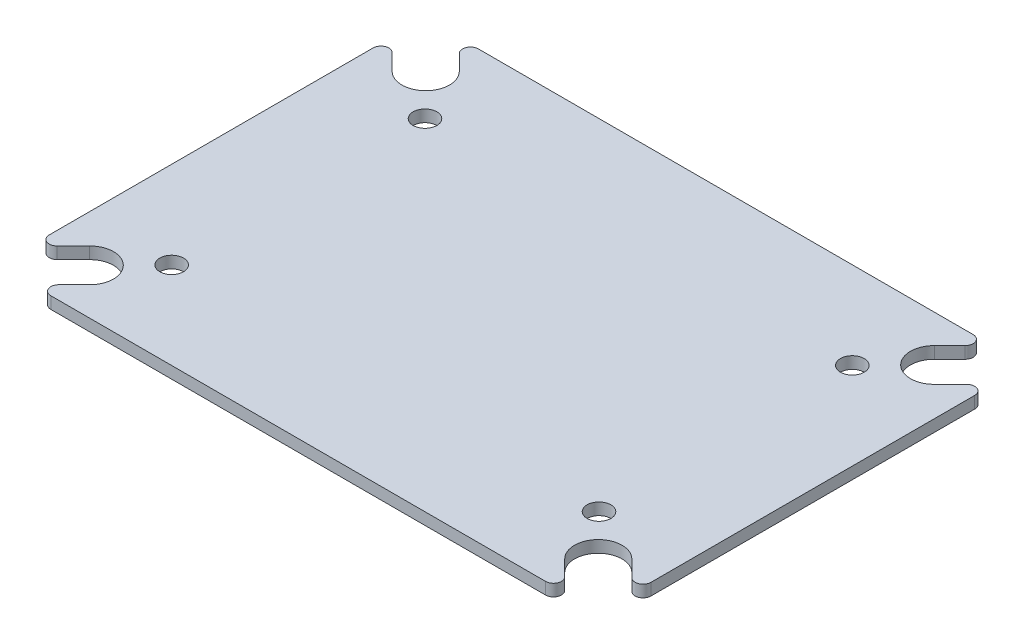
ISO-10303-21;
HEADER;
FILE_DESCRIPTION(('STEP AP214'),'2;1');
FILE_NAME('part.step','',(''),(''),'','','');
FILE_SCHEMA(('AUTOMOTIVE_DESIGN { 1 0 10303 214 1 1 1 1 }'));
ENDSEC;
DATA;
#1=APPLICATION_CONTEXT('core data for automotive mechanical design processes');
#2=APPLICATION_PROTOCOL_DEFINITION('international standard','automotive_design',2000,#1);
#3=PRODUCT_CONTEXT('',#1,'mechanical');
#4=PRODUCT('Part','Part','',(#3));
#5=PRODUCT_RELATED_PRODUCT_CATEGORY('part','',(#4));
#6=PRODUCT_DEFINITION_FORMATION('','',#4);
#7=PRODUCT_DEFINITION_CONTEXT('part definition',#1,'design');
#8=PRODUCT_DEFINITION('design','',#6,#7);
#9=PRODUCT_DEFINITION_SHAPE('','',#8);
#10=(LENGTH_UNIT() NAMED_UNIT(*) SI_UNIT(.MILLI.,.METRE.));
#11=(NAMED_UNIT(*) PLANE_ANGLE_UNIT() SI_UNIT($,.RADIAN.));
#12=(NAMED_UNIT(*) SI_UNIT($,.STERADIAN.) SOLID_ANGLE_UNIT());
#13=UNCERTAINTY_MEASURE_WITH_UNIT(LENGTH_MEASURE(1.E-05),#10,'distance_accuracy_value','');
#14=(GEOMETRIC_REPRESENTATION_CONTEXT(3) GLOBAL_UNCERTAINTY_ASSIGNED_CONTEXT((#13)) GLOBAL_UNIT_ASSIGNED_CONTEXT((#10,
#11,#12)) REPRESENTATION_CONTEXT('',''));
#15=CARTESIAN_POINT('',(0.,0.,0.));
#16=DIRECTION('',(0.,0.,1.));
#17=DIRECTION('',(1.,0.,0.));
#18=AXIS2_PLACEMENT_3D('',#15,#16,#17);
#19=CARTESIAN_POINT('',(69.2449575216843,1.5,3.));
#20=DIRECTION('',(0.,1.,0.));
#21=DIRECTION('',(0.,0.,1.));
#22=AXIS2_PLACEMENT_3D('',#19,#20,#21);
#23=PLANE('',#22);
#24=CARTESIAN_POINT('',(64.9875,1.5,44.998836792118));
#25=DIRECTION('',(0.,1.,0.));
#26=DIRECTION('',(0.,0.,1.));
#27=AXIS2_PLACEMENT_3D('',#24,#25,#26);
#28=CIRCLE('',#27,1.49999999999998);
#29=CARTESIAN_POINT('',(64.9875,1.5,46.498836792118));
#30=VERTEX_POINT('',#29);
#31=EDGE_CURVE('E446',#30,#30,#28,.T.);
#32=ORIENTED_EDGE('',*,*,#31,.F.);
#33=EDGE_LOOP('',(#32));
#34=FACE_BOUND('',#33,.T.);
#35=CARTESIAN_POINT('',(11.0125,1.5,13.001163207882));
#36=DIRECTION('',(0.,1.,0.));
#37=DIRECTION('',(0.,0.,1.));
#38=AXIS2_PLACEMENT_3D('',#35,#36,#37);
#39=CIRCLE('',#38,1.5);
#40=CARTESIAN_POINT('',(11.0125,1.5,14.501163207882));
#41=VERTEX_POINT('',#40);
#42=EDGE_CURVE('E228',#41,#41,#39,.T.);
#43=ORIENTED_EDGE('',*,*,#42,.F.);
#44=EDGE_LOOP('',(#43));
#45=FACE_BOUND('',#44,.T.);
#46=CARTESIAN_POINT('',(69.2449575216843,1.5,3.));
#47=DIRECTION('',(0.,1.,0.));
#48=DIRECTION('',(0.,0.,1.));
#49=AXIS2_PLACEMENT_3D('',#46,#47,#48);
#50=CIRCLE('',#49,1.);
#51=CARTESIAN_POINT('',(69.9513797645574,1.5,3.70779065745049));
#52=VERTEX_POINT('',#51);
#53=CARTESIAN_POINT('',(69.2449575216843,1.5,2.));
#54=VERTEX_POINT('',#53);
#55=EDGE_CURVE('E271',#52,#54,#50,.T.);
#56=ORIENTED_EDGE('',*,*,#55,.T.);
#57=DIRECTION('',(-1.,0.,0.));
#58=VECTOR('',#57,1.);
#59=CARTESIAN_POINT('',(6.75504247831573,1.5,2.00000000000001));
#60=LINE('',#59,#58);
#61=CARTESIAN_POINT('',(6.75504247831573,1.5,2.00000000000001));
#62=VERTEX_POINT('',#61);
#63=EDGE_CURVE('E139',#54,#62,#60,.T.);
#64=ORIENTED_EDGE('',*,*,#63,.T.);
#65=CARTESIAN_POINT('',(6.75504247831571,1.5,3.00000000000001));
#66=DIRECTION('',(0.,1.,0.));
#67=DIRECTION('',(0.,0.,1.));
#68=AXIS2_PLACEMENT_3D('',#65,#66,#67);
#69=CIRCLE('',#68,1.);
#70=CARTESIAN_POINT('',(6.04862023544265,1.5,3.7077906574505));
#71=VERTEX_POINT('',#70);
#72=EDGE_CURVE('E334',#62,#71,#69,.T.);
#73=ORIENTED_EDGE('',*,*,#72,.T.);
#74=DIRECTION('',(0.707790657450473,0.,0.706422242873076));
#75=VECTOR('',#74,1.);
#76=CARTESIAN_POINT('',(8.00366605642963,1.5,5.659056669856));
#77=LINE('',#76,#75);
#78=CARTESIAN_POINT('',(8.00366605642963,1.5,5.659056669856));
#79=VERTEX_POINT('',#78);
#80=EDGE_CURVE('E353',#71,#79,#77,.T.);
#81=ORIENTED_EDGE('',*,*,#80,.T.);
#82=CARTESIAN_POINT('',(5.8843993278104,1.5,7.78242864220743));
#83=DIRECTION('',(0.,-1.,0.));
#84=DIRECTION('',(0.,0.,1.));
#85=AXIS2_PLACEMENT_3D('',#82,#83,#84);
#86=CIRCLE('',#85,3.);
#87=CARTESIAN_POINT('',(3.76307898425076,1.5,9.90374898576707));
#88=VERTEX_POINT('',#87);
#89=EDGE_CURVE('E350',#79,#88,#86,.T.);
#90=ORIENTED_EDGE('',*,*,#89,.T.);
#91=DIRECTION('',(-0.707106781186546,0.,-0.707106781186549));
#92=VECTOR('',#91,1.);
#93=CARTESIAN_POINT('',(3.76307898425076,1.5,9.90374898576707));
#94=LINE('',#93,#92);
#95=CARTESIAN_POINT('',(1.70710678118657,1.5,7.84777678270287));
#96=VERTEX_POINT('',#95);
#97=EDGE_CURVE('E352',#88,#96,#94,.T.);
#98=ORIENTED_EDGE('',*,*,#97,.T.);
#99=CARTESIAN_POINT('',(1.,1.5,8.5548835638894));
#100=DIRECTION('',(0.,1.,0.));
#101=DIRECTION('',(0.,0.,-1.));
#102=AXIS2_PLACEMENT_3D('',#99,#100,#101);
#103=CIRCLE('',#102,1.);
#104=CARTESIAN_POINT('',(0.,1.5,8.55488356388942));
#105=VERTEX_POINT('',#104);
#106=EDGE_CURVE('E355',#96,#105,#103,.T.);
#107=ORIENTED_EDGE('',*,*,#106,.T.);
#108=DIRECTION('',(0.,0.,1.));
#109=VECTOR('',#108,1.);
#110=CARTESIAN_POINT('',(0.,1.5,8.55488356388942));
#111=LINE('',#110,#109);
#112=CARTESIAN_POINT('',(0.,1.5,49.4451164361106));
#113=VERTEX_POINT('',#112);
#114=EDGE_CURVE('E361',#105,#113,#111,.T.);
#115=ORIENTED_EDGE('',*,*,#114,.T.);
#116=CARTESIAN_POINT('',(1.,1.5,49.4451164361106));
#117=DIRECTION('',(0.,1.,0.));
#118=DIRECTION('',(0.,0.,-1.));
#119=AXIS2_PLACEMENT_3D('',#116,#117,#118);
#120=CIRCLE('',#119,1.);
#121=CARTESIAN_POINT('',(1.70710678118656,1.5,50.1522232172971));
#122=VERTEX_POINT('',#121);
#123=EDGE_CURVE('E363',#113,#122,#120,.T.);
#124=ORIENTED_EDGE('',*,*,#123,.T.);
#125=DIRECTION('',(0.707106781186546,0.,-0.707106781186549));
#126=VECTOR('',#125,1.);
#127=CARTESIAN_POINT('',(3.76307898425076,1.5,48.0962510142329));
#128=LINE('',#127,#126);
#129=CARTESIAN_POINT('',(3.76307898425075,1.5,48.0962510142329));
#130=VERTEX_POINT('',#129);
#131=EDGE_CURVE('E365',#122,#130,#128,.T.);
#132=ORIENTED_EDGE('',*,*,#131,.T.);
#133=CARTESIAN_POINT('',(5.8843993278104,1.5,50.2175713577926));
#134=DIRECTION('',(0.,-1.,0.));
#135=DIRECTION('',(0.,0.,-1.));
#136=AXIS2_PLACEMENT_3D('',#133,#134,#135);
#137=CIRCLE('',#136,3.);
#138=CARTESIAN_POINT('',(8.00366605642963,1.5,52.340943330144));
#139=VERTEX_POINT('',#138);
#140=EDGE_CURVE('E367',#130,#139,#137,.T.);
#141=ORIENTED_EDGE('',*,*,#140,.T.);
#142=DIRECTION('',(-0.707790657450474,0.,0.706422242873075));
#143=VECTOR('',#142,1.);
#144=CARTESIAN_POINT('',(8.00366605642963,1.5,52.340943330144));
#145=LINE('',#144,#143);
#146=CARTESIAN_POINT('',(6.04862023544265,1.5,54.2922093425495));
#147=VERTEX_POINT('',#146);
#148=EDGE_CURVE('E369',#139,#147,#145,.T.);
#149=ORIENTED_EDGE('',*,*,#148,.T.);
#150=CARTESIAN_POINT('',(6.75504247831571,1.5,55.));
#151=DIRECTION('',(0.,1.,0.));
#152=DIRECTION('',(0.,0.,1.));
#153=AXIS2_PLACEMENT_3D('',#150,#151,#152);
#154=CIRCLE('',#153,1.);
#155=CARTESIAN_POINT('',(6.75504247831573,1.5,56.));
#156=VERTEX_POINT('',#155);
#157=EDGE_CURVE('E371',#147,#156,#154,.T.);
#158=ORIENTED_EDGE('',*,*,#157,.T.);
#159=DIRECTION('',(1.,0.,0.));
#160=VECTOR('',#159,1.);
#161=CARTESIAN_POINT('',(6.75504247831573,1.5,56.));
#162=LINE('',#161,#160);
#163=CARTESIAN_POINT('',(69.2449575216843,1.5,56.));
#164=VERTEX_POINT('',#163);
#165=EDGE_CURVE('E373',#156,#164,#162,.T.);
#166=ORIENTED_EDGE('',*,*,#165,.T.);
#167=CARTESIAN_POINT('',(69.2449575216843,1.5,55.));
#168=DIRECTION('',(0.,1.,0.));
#169=DIRECTION('',(0.,0.,-1.));
#170=AXIS2_PLACEMENT_3D('',#167,#168,#169);
#171=CIRCLE('',#170,0.999999999999998);
#172=CARTESIAN_POINT('',(69.9513797645573,1.5,54.2922093425495));
#173=VERTEX_POINT('',#172);
#174=EDGE_CURVE('E375',#164,#173,#171,.T.);
#175=ORIENTED_EDGE('',*,*,#174,.T.);
#176=DIRECTION('',(-0.707790657450472,0.,-0.706422242873077));
#177=VECTOR('',#176,1.);
#178=CARTESIAN_POINT('',(67.9963339435704,1.5,52.340943330144));
#179=LINE('',#178,#177);
#180=CARTESIAN_POINT('',(67.9963339435704,1.5,52.340943330144));
#181=VERTEX_POINT('',#180);
#182=EDGE_CURVE('E377',#173,#181,#179,.T.);
#183=ORIENTED_EDGE('',*,*,#182,.T.);
#184=CARTESIAN_POINT('',(70.1156006721896,1.5,50.2175713577926));
#185=DIRECTION('',(0.,-1.,0.));
#186=DIRECTION('',(0.,0.,1.));
#187=AXIS2_PLACEMENT_3D('',#184,#185,#186);
#188=CIRCLE('',#187,3.);
#189=CARTESIAN_POINT('',(72.2369210157492,1.5,48.0962510142329));
#190=VERTEX_POINT('',#189);
#191=EDGE_CURVE('E379',#181,#190,#188,.T.);
#192=ORIENTED_EDGE('',*,*,#191,.T.);
#193=DIRECTION('',(0.707106781186547,0.,0.707106781186547));
#194=VECTOR('',#193,1.);
#195=CARTESIAN_POINT('',(72.2369210157492,1.5,48.0962510142329));
#196=LINE('',#195,#194);
#197=CARTESIAN_POINT('',(74.2928932188134,1.5,50.1522232172972));
#198=VERTEX_POINT('',#197);
#199=EDGE_CURVE('E381',#190,#198,#196,.T.);
#200=ORIENTED_EDGE('',*,*,#199,.T.);
#201=CARTESIAN_POINT('',(75.,1.5,49.4451164361106));
#202=DIRECTION('',(0.,1.,0.));
#203=DIRECTION('',(0.,0.,1.));
#204=AXIS2_PLACEMENT_3D('',#201,#202,#203);
#205=CIRCLE('',#204,0.999999999999999);
#206=CARTESIAN_POINT('',(76.,1.5,49.4451164361106));
#207=VERTEX_POINT('',#206);
#208=EDGE_CURVE('E383',#198,#207,#205,.T.);
#209=ORIENTED_EDGE('',*,*,#208,.T.);
#210=DIRECTION('',(0.,0.,-1.));
#211=VECTOR('',#210,1.);
#212=CARTESIAN_POINT('',(76.,1.5,8.55488356388941));
#213=LINE('',#212,#211);
#214=CARTESIAN_POINT('',(76.,1.5,8.55488356388941));
#215=VERTEX_POINT('',#214);
#216=EDGE_CURVE('E385',#207,#215,#213,.T.);
#217=ORIENTED_EDGE('',*,*,#216,.T.);
#218=CARTESIAN_POINT('',(75.,1.5,8.55488356388938));
#219=DIRECTION('',(0.,1.,0.));
#220=DIRECTION('',(0.,0.,-1.));
#221=AXIS2_PLACEMENT_3D('',#218,#219,#220);
#222=CIRCLE('',#221,0.999999999999998);
#223=CARTESIAN_POINT('',(74.2928932188134,1.5,7.84777678270286));
#224=VERTEX_POINT('',#223);
#225=EDGE_CURVE('E206',#215,#224,#222,.T.);
#226=ORIENTED_EDGE('',*,*,#225,.T.);
#227=DIRECTION('',(-0.707106781186548,0.,0.707106781186547));
#228=VECTOR('',#227,1.);
#229=CARTESIAN_POINT('',(72.2369210157492,1.5,9.90374898576706));
#230=LINE('',#229,#228);
#231=CARTESIAN_POINT('',(72.2369210157492,1.5,9.90374898576707));
#232=VERTEX_POINT('',#231);
#233=EDGE_CURVE('E200',#224,#232,#230,.T.);
#234=ORIENTED_EDGE('',*,*,#233,.T.);
#235=CARTESIAN_POINT('',(70.1156006721896,1.5,7.78242864220742));
#236=DIRECTION('',(0.,-1.,0.));
#237=DIRECTION('',(0.,0.,-1.));
#238=AXIS2_PLACEMENT_3D('',#235,#236,#237);
#239=CIRCLE('',#238,3.00000000000001);
#240=CARTESIAN_POINT('',(67.9963339435703,1.5,5.65905666985599));
#241=VERTEX_POINT('',#240);
#242=EDGE_CURVE('E204',#232,#241,#239,.T.);
#243=ORIENTED_EDGE('',*,*,#242,.T.);
#244=DIRECTION('',(0.707790657450478,0.,-0.706422242873071));
#245=VECTOR('',#244,1.);
#246=CARTESIAN_POINT('',(67.9963339435703,1.5,5.65905666985599));
#247=LINE('',#246,#245);
#248=EDGE_CURVE('E48',#241,#52,#247,.T.);
#249=ORIENTED_EDGE('',*,*,#248,.T.);
#250=EDGE_LOOP('',(#56,#64,#73,#81,#90,#98,#107,#115,#124,#132,#141,#149,#158,#166,#175,#183,
#192,#200,#209,#217,#226,#234,#243,#249));
#251=FACE_BOUND('',#250,.T.);
#252=CARTESIAN_POINT('',(64.9875,1.5,13.001163207882));
#253=DIRECTION('',(0.,1.,0.));
#254=DIRECTION('',(0.,0.,-1.));
#255=AXIS2_PLACEMENT_3D('',#252,#253,#254);
#256=CIRCLE('',#255,1.49999999999998);
#257=CARTESIAN_POINT('',(64.9875,1.5,11.501163207882));
#258=VERTEX_POINT('',#257);
#259=EDGE_CURVE('E452',#258,#258,#256,.T.);
#260=ORIENTED_EDGE('',*,*,#259,.F.);
#261=EDGE_LOOP('',(#260));
#262=FACE_BOUND('',#261,.T.);
#263=CARTESIAN_POINT('',(11.0125,1.5,44.998836792118));
#264=DIRECTION('',(0.,1.,0.));
#265=DIRECTION('',(0.,0.,-1.));
#266=AXIS2_PLACEMENT_3D('',#263,#264,#265);
#267=CIRCLE('',#266,1.5);
#268=CARTESIAN_POINT('',(11.0125,1.5,43.498836792118));
#269=VERTEX_POINT('',#268);
#270=EDGE_CURVE('E437',#269,#269,#267,.T.);
#271=ORIENTED_EDGE('',*,*,#270,.F.);
#272=EDGE_LOOP('',(#271));
#273=FACE_BOUND('',#272,.T.);
#274=ADVANCED_FACE('F31',(#34,#45,#251,#262,#273),#23,.T.);
#275=CARTESIAN_POINT('',(69.2449575216843,0.,3.));
#276=DIRECTION('',(0.,1.,0.));
#277=DIRECTION('',(0.,0.,1.));
#278=AXIS2_PLACEMENT_3D('',#275,#276,#277);
#279=PLANE('',#278);
#280=CARTESIAN_POINT('',(64.9875,0.,44.998836792118));
#281=DIRECTION('',(0.,1.,0.));
#282=DIRECTION('',(0.,0.,1.));
#283=AXIS2_PLACEMENT_3D('',#280,#281,#282);
#284=CIRCLE('',#283,1.49999999999998);
#285=CARTESIAN_POINT('',(64.9875,0.,46.498836792118));
#286=VERTEX_POINT('',#285);
#287=EDGE_CURVE('E443',#286,#286,#284,.T.);
#288=ORIENTED_EDGE('',*,*,#287,.T.);
#289=EDGE_LOOP('',(#288));
#290=FACE_BOUND('',#289,.T.);
#291=CARTESIAN_POINT('',(11.0125,0.,13.001163207882));
#292=DIRECTION('',(0.,1.,0.));
#293=DIRECTION('',(0.,0.,1.));
#294=AXIS2_PLACEMENT_3D('',#291,#292,#293);
#295=CIRCLE('',#294,1.5);
#296=CARTESIAN_POINT('',(11.0125,0.,14.501163207882));
#297=VERTEX_POINT('',#296);
#298=EDGE_CURVE('E455',#297,#297,#295,.T.);
#299=ORIENTED_EDGE('',*,*,#298,.T.);
#300=EDGE_LOOP('',(#299));
#301=FACE_BOUND('',#300,.T.);
#302=CARTESIAN_POINT('',(69.2449575216843,0.,3.));
#303=DIRECTION('',(0.,1.,0.));
#304=DIRECTION('',(0.,0.,1.));
#305=AXIS2_PLACEMENT_3D('',#302,#303,#304);
#306=CIRCLE('',#305,1.);
#307=CARTESIAN_POINT('',(69.9513797645574,0.,3.70779065745049));
#308=VERTEX_POINT('',#307);
#309=CARTESIAN_POINT('',(69.2449575216843,0.,2.));
#310=VERTEX_POINT('',#309);
#311=EDGE_CURVE('E224',#308,#310,#306,.T.);
#312=ORIENTED_EDGE('',*,*,#311,.F.);
#313=DIRECTION('',(0.707790657450478,0.,-0.706422242873071));
#314=VECTOR('',#313,1.);
#315=CARTESIAN_POINT('',(67.9963339435703,0.,5.65905666985599));
#316=LINE('',#315,#314);
#317=CARTESIAN_POINT('',(67.9963339435703,0.,5.65905666985599));
#318=VERTEX_POINT('',#317);
#319=EDGE_CURVE('E131',#318,#308,#316,.T.);
#320=ORIENTED_EDGE('',*,*,#319,.F.);
#321=CARTESIAN_POINT('',(70.1156006721896,0.,7.78242864220742));
#322=DIRECTION('',(0.,-1.,0.));
#323=DIRECTION('',(0.,0.,-1.));
#324=AXIS2_PLACEMENT_3D('',#321,#322,#323);
#325=CIRCLE('',#324,3.00000000000001);
#326=CARTESIAN_POINT('',(72.2369210157492,0.,9.90374898576707));
#327=VERTEX_POINT('',#326);
#328=EDGE_CURVE('E125',#327,#318,#325,.T.);
#329=ORIENTED_EDGE('',*,*,#328,.F.);
#330=DIRECTION('',(-0.707106781186548,0.,0.707106781186547));
#331=VECTOR('',#330,1.);
#332=CARTESIAN_POINT('',(72.2369210157492,0.,9.90374898576706));
#333=LINE('',#332,#331);
#334=CARTESIAN_POINT('',(74.2928932188134,0.,7.84777678270286));
#335=VERTEX_POINT('',#334);
#336=EDGE_CURVE('E214',#335,#327,#333,.T.);
#337=ORIENTED_EDGE('',*,*,#336,.F.);
#338=CARTESIAN_POINT('',(75.,0.,8.55488356388938));
#339=DIRECTION('',(0.,1.,0.));
#340=DIRECTION('',(0.,0.,-1.));
#341=AXIS2_PLACEMENT_3D('',#338,#339,#340);
#342=CIRCLE('',#341,0.999999999999998);
#343=CARTESIAN_POINT('',(76.,0.,8.55488356388941));
#344=VERTEX_POINT('',#343);
#345=EDGE_CURVE('E266',#344,#335,#342,.T.);
#346=ORIENTED_EDGE('',*,*,#345,.F.);
#347=DIRECTION('',(0.,0.,-1.));
#348=VECTOR('',#347,1.);
#349=CARTESIAN_POINT('',(76.,0.,8.55488356388941));
#350=LINE('',#349,#348);
#351=CARTESIAN_POINT('',(76.,0.,49.4451164361106));
#352=VERTEX_POINT('',#351);
#353=EDGE_CURVE('E264',#352,#344,#350,.T.);
#354=ORIENTED_EDGE('',*,*,#353,.F.);
#355=CARTESIAN_POINT('',(75.,0.,49.4451164361106));
#356=DIRECTION('',(0.,1.,0.));
#357=DIRECTION('',(0.,0.,1.));
#358=AXIS2_PLACEMENT_3D('',#355,#356,#357);
#359=CIRCLE('',#358,0.999999999999999);
#360=CARTESIAN_POINT('',(74.2928932188134,0.,50.1522232172972));
#361=VERTEX_POINT('',#360);
#362=EDGE_CURVE('E262',#361,#352,#359,.T.);
#363=ORIENTED_EDGE('',*,*,#362,.F.);
#364=DIRECTION('',(0.707106781186547,0.,0.707106781186547));
#365=VECTOR('',#364,1.);
#366=CARTESIAN_POINT('',(72.2369210157492,0.,48.0962510142329));
#367=LINE('',#366,#365);
#368=CARTESIAN_POINT('',(72.2369210157492,0.,48.0962510142329));
#369=VERTEX_POINT('',#368);
#370=EDGE_CURVE('E260',#369,#361,#367,.T.);
#371=ORIENTED_EDGE('',*,*,#370,.F.);
#372=CARTESIAN_POINT('',(70.1156006721896,0.,50.2175713577926));
#373=DIRECTION('',(0.,-1.,0.));
#374=DIRECTION('',(0.,0.,1.));
#375=AXIS2_PLACEMENT_3D('',#372,#373,#374);
#376=CIRCLE('',#375,3.);
#377=CARTESIAN_POINT('',(67.9963339435704,0.,52.340943330144));
#378=VERTEX_POINT('',#377);
#379=EDGE_CURVE('E258',#378,#369,#376,.T.);
#380=ORIENTED_EDGE('',*,*,#379,.F.);
#381=DIRECTION('',(-0.707790657450472,0.,-0.706422242873077));
#382=VECTOR('',#381,1.);
#383=CARTESIAN_POINT('',(67.9963339435704,0.,52.340943330144));
#384=LINE('',#383,#382);
#385=CARTESIAN_POINT('',(69.9513797645573,0.,54.2922093425495));
#386=VERTEX_POINT('',#385);
#387=EDGE_CURVE('E256',#386,#378,#384,.T.);
#388=ORIENTED_EDGE('',*,*,#387,.F.);
#389=CARTESIAN_POINT('',(69.2449575216843,0.,55.));
#390=DIRECTION('',(0.,1.,0.));
#391=DIRECTION('',(0.,0.,-1.));
#392=AXIS2_PLACEMENT_3D('',#389,#390,#391);
#393=CIRCLE('',#392,0.999999999999998);
#394=CARTESIAN_POINT('',(69.2449575216843,0.,56.));
#395=VERTEX_POINT('',#394);
#396=EDGE_CURVE('E254',#395,#386,#393,.T.);
#397=ORIENTED_EDGE('',*,*,#396,.F.);
#398=DIRECTION('',(1.,0.,0.));
#399=VECTOR('',#398,1.);
#400=CARTESIAN_POINT('',(6.75504247831573,0.,56.));
#401=LINE('',#400,#399);
#402=CARTESIAN_POINT('',(6.75504247831573,0.,56.));
#403=VERTEX_POINT('',#402);
#404=EDGE_CURVE('E252',#403,#395,#401,.T.);
#405=ORIENTED_EDGE('',*,*,#404,.F.);
#406=CARTESIAN_POINT('',(6.75504247831571,0.,55.));
#407=DIRECTION('',(0.,1.,0.));
#408=DIRECTION('',(0.,0.,1.));
#409=AXIS2_PLACEMENT_3D('',#406,#407,#408);
#410=CIRCLE('',#409,1.);
#411=CARTESIAN_POINT('',(6.04862023544265,0.,54.2922093425495));
#412=VERTEX_POINT('',#411);
#413=EDGE_CURVE('E250',#412,#403,#410,.T.);
#414=ORIENTED_EDGE('',*,*,#413,.F.);
#415=DIRECTION('',(-0.707790657450474,0.,0.706422242873075));
#416=VECTOR('',#415,1.);
#417=CARTESIAN_POINT('',(8.00366605642963,0.,52.340943330144));
#418=LINE('',#417,#416);
#419=CARTESIAN_POINT('',(8.00366605642963,0.,52.340943330144));
#420=VERTEX_POINT('',#419);
#421=EDGE_CURVE('E248',#420,#412,#418,.T.);
#422=ORIENTED_EDGE('',*,*,#421,.F.);
#423=CARTESIAN_POINT('',(5.8843993278104,0.,50.2175713577926));
#424=DIRECTION('',(0.,-1.,0.));
#425=DIRECTION('',(0.,0.,-1.));
#426=AXIS2_PLACEMENT_3D('',#423,#424,#425);
#427=CIRCLE('',#426,3.);
#428=CARTESIAN_POINT('',(3.76307898425075,0.,48.0962510142329));
#429=VERTEX_POINT('',#428);
#430=EDGE_CURVE('E246',#429,#420,#427,.T.);
#431=ORIENTED_EDGE('',*,*,#430,.F.);
#432=DIRECTION('',(0.707106781186546,0.,-0.707106781186549));
#433=VECTOR('',#432,1.);
#434=CARTESIAN_POINT('',(3.76307898425076,0.,48.0962510142329));
#435=LINE('',#434,#433);
#436=CARTESIAN_POINT('',(1.70710678118656,0.,50.1522232172971));
#437=VERTEX_POINT('',#436);
#438=EDGE_CURVE('E244',#437,#429,#435,.T.);
#439=ORIENTED_EDGE('',*,*,#438,.F.);
#440=CARTESIAN_POINT('',(1.,0.,49.4451164361106));
#441=DIRECTION('',(0.,1.,0.));
#442=DIRECTION('',(0.,0.,-1.));
#443=AXIS2_PLACEMENT_3D('',#440,#441,#442);
#444=CIRCLE('',#443,1.);
#445=CARTESIAN_POINT('',(0.,0.,49.4451164361106));
#446=VERTEX_POINT('',#445);
#447=EDGE_CURVE('E242',#446,#437,#444,.T.);
#448=ORIENTED_EDGE('',*,*,#447,.F.);
#449=DIRECTION('',(0.,0.,1.));
#450=VECTOR('',#449,1.);
#451=CARTESIAN_POINT('',(0.,0.,8.55488356388942));
#452=LINE('',#451,#450);
#453=CARTESIAN_POINT('',(0.,0.,8.55488356388942));
#454=VERTEX_POINT('',#453);
#455=EDGE_CURVE('E240',#454,#446,#452,.T.);
#456=ORIENTED_EDGE('',*,*,#455,.F.);
#457=CARTESIAN_POINT('',(1.,0.,8.5548835638894));
#458=DIRECTION('',(0.,1.,0.));
#459=DIRECTION('',(0.,0.,-1.));
#460=AXIS2_PLACEMENT_3D('',#457,#458,#459);
#461=CIRCLE('',#460,1.);
#462=CARTESIAN_POINT('',(1.70710678118657,0.,7.84777678270287));
#463=VERTEX_POINT('',#462);
#464=EDGE_CURVE('E238',#463,#454,#461,.T.);
#465=ORIENTED_EDGE('',*,*,#464,.F.);
#466=DIRECTION('',(-0.707106781186546,0.,-0.707106781186549));
#467=VECTOR('',#466,1.);
#468=CARTESIAN_POINT('',(3.76307898425076,0.,9.90374898576707));
#469=LINE('',#468,#467);
#470=CARTESIAN_POINT('',(3.76307898425076,0.,9.90374898576707));
#471=VERTEX_POINT('',#470);
#472=EDGE_CURVE('E236',#471,#463,#469,.T.);
#473=ORIENTED_EDGE('',*,*,#472,.F.);
#474=CARTESIAN_POINT('',(5.8843993278104,0.,7.78242864220743));
#475=DIRECTION('',(0.,-1.,0.));
#476=DIRECTION('',(0.,0.,1.));
#477=AXIS2_PLACEMENT_3D('',#474,#475,#476);
#478=CIRCLE('',#477,3.);
#479=CARTESIAN_POINT('',(8.00366605642963,0.,5.659056669856));
#480=VERTEX_POINT('',#479);
#481=EDGE_CURVE('E234',#480,#471,#478,.T.);
#482=ORIENTED_EDGE('',*,*,#481,.F.);
#483=DIRECTION('',(0.707790657450473,0.,0.706422242873076));
#484=VECTOR('',#483,1.);
#485=CARTESIAN_POINT('',(8.00366605642963,0.,5.659056669856));
#486=LINE('',#485,#484);
#487=CARTESIAN_POINT('',(6.04862023544265,0.,3.7077906574505));
#488=VERTEX_POINT('',#487);
#489=EDGE_CURVE('E232',#488,#480,#486,.T.);
#490=ORIENTED_EDGE('',*,*,#489,.F.);
#491=CARTESIAN_POINT('',(6.75504247831571,0.,3.00000000000001));
#492=DIRECTION('',(0.,1.,0.));
#493=DIRECTION('',(0.,0.,1.));
#494=AXIS2_PLACEMENT_3D('',#491,#492,#493);
#495=CIRCLE('',#494,1.);
#496=CARTESIAN_POINT('',(6.75504247831573,0.,2.00000000000001));
#497=VERTEX_POINT('',#496);
#498=EDGE_CURVE('E230',#497,#488,#495,.T.);
#499=ORIENTED_EDGE('',*,*,#498,.F.);
#500=DIRECTION('',(-1.,0.,0.));
#501=VECTOR('',#500,1.);
#502=CARTESIAN_POINT('',(6.75504247831573,0.,2.00000000000001));
#503=LINE('',#502,#501);
#504=EDGE_CURVE('E227',#310,#497,#503,.T.);
#505=ORIENTED_EDGE('',*,*,#504,.F.);
#506=EDGE_LOOP('',(#312,#320,#329,#337,#346,#354,#363,#371,#380,#388,#397,#405,#414,#422,#431,
#439,#448,#456,#465,#473,#482,#490,#499,#505));
#507=FACE_BOUND('',#506,.T.);
#508=CARTESIAN_POINT('',(64.9875,0.,13.001163207882));
#509=DIRECTION('',(0.,1.,0.));
#510=DIRECTION('',(0.,0.,-1.));
#511=AXIS2_PLACEMENT_3D('',#508,#509,#510);
#512=CIRCLE('',#511,1.49999999999998);
#513=CARTESIAN_POINT('',(64.9875,0.,11.501163207882));
#514=VERTEX_POINT('',#513);
#515=EDGE_CURVE('E449',#514,#514,#512,.T.);
#516=ORIENTED_EDGE('',*,*,#515,.T.);
#517=EDGE_LOOP('',(#516));
#518=FACE_BOUND('',#517,.T.);
#519=CARTESIAN_POINT('',(11.0125,0.,44.998836792118));
#520=DIRECTION('',(0.,1.,0.));
#521=DIRECTION('',(0.,0.,-1.));
#522=AXIS2_PLACEMENT_3D('',#519,#520,#521);
#523=CIRCLE('',#522,1.5);
#524=CARTESIAN_POINT('',(11.0125,0.,43.498836792118));
#525=VERTEX_POINT('',#524);
#526=EDGE_CURVE('E440',#525,#525,#523,.T.);
#527=ORIENTED_EDGE('',*,*,#526,.T.);
#528=EDGE_LOOP('',(#527));
#529=FACE_BOUND('',#528,.T.);
#530=ADVANCED_FACE('F338',(#290,#301,#507,#518,#529),#279,.F.);
#531=CARTESIAN_POINT('',(69.2449575216843,1.5,3.));
#532=DIRECTION('',(0.,-1.,0.));
#533=DIRECTION('',(0.,0.,-1.));
#534=AXIS2_PLACEMENT_3D('',#531,#532,#533);
#535=CYLINDRICAL_SURFACE('',#534,1.);
#536=ORIENTED_EDGE('',*,*,#311,.T.);
#537=DIRECTION('',(0.,-1.,0.));
#538=VECTOR('',#537,1.);
#539=CARTESIAN_POINT('',(69.2449575216843,1.5,2.));
#540=LINE('',#539,#538);
#541=EDGE_CURVE('E11',#54,#310,#540,.T.);
#542=ORIENTED_EDGE('',*,*,#541,.F.);
#543=ORIENTED_EDGE('',*,*,#55,.F.);
#544=DIRECTION('',(0.,-1.,0.));
#545=VECTOR('',#544,1.);
#546=CARTESIAN_POINT('',(69.9513797645574,1.5,3.70779065745049));
#547=LINE('',#546,#545);
#548=EDGE_CURVE('E220',#52,#308,#547,.T.);
#549=ORIENTED_EDGE('',*,*,#548,.T.);
#550=EDGE_LOOP('',(#536,#542,#543,#549));
#551=FACE_BOUND('',#550,.T.);
#552=ADVANCED_FACE('F33',(#551),#535,.T.);
#553=CARTESIAN_POINT('',(6.75504247831573,1.5,2.00000000000001));
#554=DIRECTION('',(0.,0.,1.));
#555=DIRECTION('',(1.,0.,0.));
#556=AXIS2_PLACEMENT_3D('',#553,#554,#555);
#557=PLANE('',#556);
#558=ORIENTED_EDGE('',*,*,#504,.T.);
#559=DIRECTION('',(0.,-1.,0.));
#560=VECTOR('',#559,1.);
#561=CARTESIAN_POINT('',(6.75504247831573,1.5,2.00000000000001));
#562=LINE('',#561,#560);
#563=EDGE_CURVE('E40',#62,#497,#562,.T.);
#564=ORIENTED_EDGE('',*,*,#563,.F.);
#565=ORIENTED_EDGE('',*,*,#63,.F.);
#566=ORIENTED_EDGE('',*,*,#541,.T.);
#567=EDGE_LOOP('',(#558,#564,#565,#566));
#568=FACE_BOUND('',#567,.T.);
#569=ADVANCED_FACE('F684',(#568),#557,.F.);
#570=CARTESIAN_POINT('',(6.75504247831571,1.5,3.00000000000001));
#571=DIRECTION('',(0.,-1.,0.));
#572=DIRECTION('',(0.,0.,-1.));
#573=AXIS2_PLACEMENT_3D('',#570,#571,#572);
#574=CYLINDRICAL_SURFACE('',#573,1.);
#575=ORIENTED_EDGE('',*,*,#498,.T.);
#576=DIRECTION('',(0.,-1.,0.));
#577=VECTOR('',#576,1.);
#578=CARTESIAN_POINT('',(6.04862023544265,1.5,3.7077906574505));
#579=LINE('',#578,#577);
#580=EDGE_CURVE('E326',#71,#488,#579,.T.);
#581=ORIENTED_EDGE('',*,*,#580,.F.);
#582=ORIENTED_EDGE('',*,*,#72,.F.);
#583=ORIENTED_EDGE('',*,*,#563,.T.);
#584=EDGE_LOOP('',(#575,#581,#582,#583));
#585=FACE_BOUND('',#584,.T.);
#586=ADVANCED_FACE('F332',(#585),#574,.T.);
#587=CARTESIAN_POINT('',(8.00366605642963,1.5,5.659056669856));
#588=DIRECTION('',(0.706422242873076,0.,-0.707790657450473));
#589=DIRECTION('',(-0.707790657450473,0.,-0.706422242873076));
#590=AXIS2_PLACEMENT_3D('',#587,#588,#589);
#591=PLANE('',#590);
#592=ORIENTED_EDGE('',*,*,#489,.T.);
#593=DIRECTION('',(0.,-1.,0.));
#594=VECTOR('',#593,1.);
#595=CARTESIAN_POINT('',(8.00366605642963,1.5,5.659056669856));
#596=LINE('',#595,#594);
#597=EDGE_CURVE('E323',#79,#480,#596,.T.);
#598=ORIENTED_EDGE('',*,*,#597,.F.);
#599=ORIENTED_EDGE('',*,*,#80,.F.);
#600=ORIENTED_EDGE('',*,*,#580,.T.);
#601=EDGE_LOOP('',(#592,#598,#599,#600));
#602=FACE_BOUND('',#601,.T.);
#603=ADVANCED_FACE('F344',(#602),#591,.F.);
#604=CARTESIAN_POINT('',(5.8843993278104,1.5,7.78242864220743));
#605=DIRECTION('',(0.,-1.,0.));
#606=DIRECTION('',(0.,0.,-1.));
#607=AXIS2_PLACEMENT_3D('',#604,#605,#606);
#608=CYLINDRICAL_SURFACE('',#607,3.);
#609=ORIENTED_EDGE('',*,*,#481,.T.);
#610=DIRECTION('',(0.,-1.,0.));
#611=VECTOR('',#610,1.);
#612=CARTESIAN_POINT('',(3.76307898425076,1.5,9.90374898576707));
#613=LINE('',#612,#611);
#614=EDGE_CURVE('E320',#88,#471,#613,.T.);
#615=ORIENTED_EDGE('',*,*,#614,.F.);
#616=ORIENTED_EDGE('',*,*,#89,.F.);
#617=ORIENTED_EDGE('',*,*,#597,.T.);
#618=EDGE_LOOP('',(#609,#615,#616,#617));
#619=FACE_BOUND('',#618,.T.);
#620=ADVANCED_FACE('F348',(#619),#608,.F.);
#621=CARTESIAN_POINT('',(3.76307898425076,1.5,9.90374898576707));
#622=DIRECTION('',(-0.707106781186549,0.,0.707106781186546));
#623=DIRECTION('',(0.707106781186546,0.,0.707106781186549));
#624=AXIS2_PLACEMENT_3D('',#621,#622,#623);
#625=PLANE('',#624);
#626=ORIENTED_EDGE('',*,*,#472,.T.);
#627=DIRECTION('',(0.,-1.,0.));
#628=VECTOR('',#627,1.);
#629=CARTESIAN_POINT('',(1.70710678118657,1.5,7.84777678270287));
#630=LINE('',#629,#628);
#631=EDGE_CURVE('E317',#96,#463,#630,.T.);
#632=ORIENTED_EDGE('',*,*,#631,.F.);
#633=ORIENTED_EDGE('',*,*,#97,.F.);
#634=ORIENTED_EDGE('',*,*,#614,.T.);
#635=EDGE_LOOP('',(#626,#632,#633,#634));
#636=FACE_BOUND('',#635,.T.);
#637=ADVANCED_FACE('F649',(#636),#625,.F.);
#638=CARTESIAN_POINT('',(1.,1.5,8.5548835638894));
#639=DIRECTION('',(0.,-1.,0.));
#640=DIRECTION('',(0.,0.,-1.));
#641=AXIS2_PLACEMENT_3D('',#638,#639,#640);
#642=CYLINDRICAL_SURFACE('',#641,1.);
#643=ORIENTED_EDGE('',*,*,#464,.T.);
#644=DIRECTION('',(0.,-1.,0.));
#645=VECTOR('',#644,1.);
#646=CARTESIAN_POINT('',(0.,1.5,8.55488356388942));
#647=LINE('',#646,#645);
#648=EDGE_CURVE('E314',#105,#454,#647,.T.);
#649=ORIENTED_EDGE('',*,*,#648,.F.);
#650=ORIENTED_EDGE('',*,*,#106,.F.);
#651=ORIENTED_EDGE('',*,*,#631,.T.);
#652=EDGE_LOOP('',(#643,#649,#650,#651));
#653=FACE_BOUND('',#652,.T.);
#654=ADVANCED_FACE('F639',(#653),#642,.T.);
#655=CARTESIAN_POINT('',(0.,1.5,8.55488356388942));
#656=DIRECTION('',(1.,0.,0.));
#657=DIRECTION('',(0.,0.,-1.));
#658=AXIS2_PLACEMENT_3D('',#655,#656,#657);
#659=PLANE('',#658);
#660=ORIENTED_EDGE('',*,*,#455,.T.);
#661=DIRECTION('',(0.,-1.,0.));
#662=VECTOR('',#661,1.);
#663=CARTESIAN_POINT('',(0.,1.5,49.4451164361106));
#664=LINE('',#663,#662);
#665=EDGE_CURVE('E311',#113,#446,#664,.T.);
#666=ORIENTED_EDGE('',*,*,#665,.F.);
#667=ORIENTED_EDGE('',*,*,#114,.F.);
#668=ORIENTED_EDGE('',*,*,#648,.T.);
#669=EDGE_LOOP('',(#660,#666,#667,#668));
#670=FACE_BOUND('',#669,.T.);
#671=ADVANCED_FACE('F629',(#670),#659,.F.);
#672=CARTESIAN_POINT('',(1.,1.5,49.4451164361106));
#673=DIRECTION('',(0.,-1.,0.));
#674=DIRECTION('',(0.,0.,-1.));
#675=AXIS2_PLACEMENT_3D('',#672,#673,#674);
#676=CYLINDRICAL_SURFACE('',#675,1.);
#677=ORIENTED_EDGE('',*,*,#447,.T.);
#678=DIRECTION('',(0.,-1.,0.));
#679=VECTOR('',#678,1.);
#680=CARTESIAN_POINT('',(1.70710678118656,1.5,50.1522232172971));
#681=LINE('',#680,#679);
#682=EDGE_CURVE('E308',#122,#437,#681,.T.);
#683=ORIENTED_EDGE('',*,*,#682,.F.);
#684=ORIENTED_EDGE('',*,*,#123,.F.);
#685=ORIENTED_EDGE('',*,*,#665,.T.);
#686=EDGE_LOOP('',(#677,#683,#684,#685));
#687=FACE_BOUND('',#686,.T.);
#688=ADVANCED_FACE('F619',(#687),#676,.T.);
#689=CARTESIAN_POINT('',(3.76307898425076,1.5,48.0962510142329));
#690=DIRECTION('',(-0.707106781186549,0.,-0.707106781186546));
#691=DIRECTION('',(-0.707106781186546,0.,0.707106781186549));
#692=AXIS2_PLACEMENT_3D('',#689,#690,#691);
#693=PLANE('',#692);
#694=ORIENTED_EDGE('',*,*,#438,.T.);
#695=DIRECTION('',(0.,-1.,0.));
#696=VECTOR('',#695,1.);
#697=CARTESIAN_POINT('',(3.76307898425075,1.5,48.0962510142329));
#698=LINE('',#697,#696);
#699=EDGE_CURVE('E305',#130,#429,#698,.T.);
#700=ORIENTED_EDGE('',*,*,#699,.F.);
#701=ORIENTED_EDGE('',*,*,#131,.F.);
#702=ORIENTED_EDGE('',*,*,#682,.T.);
#703=EDGE_LOOP('',(#694,#700,#701,#702));
#704=FACE_BOUND('',#703,.T.);
#705=ADVANCED_FACE('F609',(#704),#693,.F.);
#706=CARTESIAN_POINT('',(5.8843993278104,1.5,50.2175713577926));
#707=DIRECTION('',(0.,-1.,0.));
#708=DIRECTION('',(0.,0.,-1.));
#709=AXIS2_PLACEMENT_3D('',#706,#707,#708);
#710=CYLINDRICAL_SURFACE('',#709,3.);
#711=ORIENTED_EDGE('',*,*,#430,.T.);
#712=DIRECTION('',(0.,-1.,0.));
#713=VECTOR('',#712,1.);
#714=CARTESIAN_POINT('',(8.00366605642963,1.5,52.340943330144));
#715=LINE('',#714,#713);
#716=EDGE_CURVE('E302',#139,#420,#715,.T.);
#717=ORIENTED_EDGE('',*,*,#716,.F.);
#718=ORIENTED_EDGE('',*,*,#140,.F.);
#719=ORIENTED_EDGE('',*,*,#699,.T.);
#720=EDGE_LOOP('',(#711,#717,#718,#719));
#721=FACE_BOUND('',#720,.T.);
#722=ADVANCED_FACE('F599',(#721),#710,.F.);
#723=CARTESIAN_POINT('',(8.00366605642963,1.5,52.340943330144));
#724=DIRECTION('',(0.706422242873075,0.,0.707790657450474));
#725=DIRECTION('',(0.707790657450474,0.,-0.706422242873075));
#726=AXIS2_PLACEMENT_3D('',#723,#724,#725);
#727=PLANE('',#726);
#728=ORIENTED_EDGE('',*,*,#421,.T.);
#729=DIRECTION('',(0.,-1.,0.));
#730=VECTOR('',#729,1.);
#731=CARTESIAN_POINT('',(6.04862023544265,1.5,54.2922093425495));
#732=LINE('',#731,#730);
#733=EDGE_CURVE('E299',#147,#412,#732,.T.);
#734=ORIENTED_EDGE('',*,*,#733,.F.);
#735=ORIENTED_EDGE('',*,*,#148,.F.);
#736=ORIENTED_EDGE('',*,*,#716,.T.);
#737=EDGE_LOOP('',(#728,#734,#735,#736));
#738=FACE_BOUND('',#737,.T.);
#739=ADVANCED_FACE('F589',(#738),#727,.F.);
#740=CARTESIAN_POINT('',(6.75504247831571,1.5,55.));
#741=DIRECTION('',(0.,-1.,0.));
#742=DIRECTION('',(0.,0.,-1.));
#743=AXIS2_PLACEMENT_3D('',#740,#741,#742);
#744=CYLINDRICAL_SURFACE('',#743,1.);
#745=ORIENTED_EDGE('',*,*,#413,.T.);
#746=DIRECTION('',(0.,-1.,0.));
#747=VECTOR('',#746,1.);
#748=CARTESIAN_POINT('',(6.75504247831573,1.5,56.));
#749=LINE('',#748,#747);
#750=EDGE_CURVE('E296',#156,#403,#749,.T.);
#751=ORIENTED_EDGE('',*,*,#750,.F.);
#752=ORIENTED_EDGE('',*,*,#157,.F.);
#753=ORIENTED_EDGE('',*,*,#733,.T.);
#754=EDGE_LOOP('',(#745,#751,#752,#753));
#755=FACE_BOUND('',#754,.T.);
#756=ADVANCED_FACE('F579',(#755),#744,.T.);
#757=CARTESIAN_POINT('',(6.75504247831573,1.5,56.));
#758=DIRECTION('',(0.,0.,-1.));
#759=DIRECTION('',(-1.,0.,0.));
#760=AXIS2_PLACEMENT_3D('',#757,#758,#759);
#761=PLANE('',#760);
#762=ORIENTED_EDGE('',*,*,#404,.T.);
#763=DIRECTION('',(0.,-1.,0.));
#764=VECTOR('',#763,1.);
#765=CARTESIAN_POINT('',(69.2449575216843,1.5,56.));
#766=LINE('',#765,#764);
#767=EDGE_CURVE('E293',#164,#395,#766,.T.);
#768=ORIENTED_EDGE('',*,*,#767,.F.);
#769=ORIENTED_EDGE('',*,*,#165,.F.);
#770=ORIENTED_EDGE('',*,*,#750,.T.);
#771=EDGE_LOOP('',(#762,#768,#769,#770));
#772=FACE_BOUND('',#771,.T.);
#773=ADVANCED_FACE('F569',(#772),#761,.F.);
#774=CARTESIAN_POINT('',(69.2449575216843,1.5,55.));
#775=DIRECTION('',(0.,-1.,0.));
#776=DIRECTION('',(0.,0.,-1.));
#777=AXIS2_PLACEMENT_3D('',#774,#775,#776);
#778=CYLINDRICAL_SURFACE('',#777,0.999999999999998);
#779=ORIENTED_EDGE('',*,*,#396,.T.);
#780=DIRECTION('',(0.,-1.,0.));
#781=VECTOR('',#780,1.);
#782=CARTESIAN_POINT('',(69.9513797645573,1.5,54.2922093425495));
#783=LINE('',#782,#781);
#784=EDGE_CURVE('E290',#173,#386,#783,.T.);
#785=ORIENTED_EDGE('',*,*,#784,.F.);
#786=ORIENTED_EDGE('',*,*,#174,.F.);
#787=ORIENTED_EDGE('',*,*,#767,.T.);
#788=EDGE_LOOP('',(#779,#785,#786,#787));
#789=FACE_BOUND('',#788,.T.);
#790=ADVANCED_FACE('F559',(#789),#778,.T.);
#791=CARTESIAN_POINT('',(67.9963339435704,1.5,52.340943330144));
#792=DIRECTION('',(-0.706422242873077,0.,0.707790657450472));
#793=DIRECTION('',(0.707790657450472,0.,0.706422242873077));
#794=AXIS2_PLACEMENT_3D('',#791,#792,#793);
#795=PLANE('',#794);
#796=ORIENTED_EDGE('',*,*,#387,.T.);
#797=DIRECTION('',(0.,-1.,0.));
#798=VECTOR('',#797,1.);
#799=CARTESIAN_POINT('',(67.9963339435704,1.5,52.340943330144));
#800=LINE('',#799,#798);
#801=EDGE_CURVE('E287',#181,#378,#800,.T.);
#802=ORIENTED_EDGE('',*,*,#801,.F.);
#803=ORIENTED_EDGE('',*,*,#182,.F.);
#804=ORIENTED_EDGE('',*,*,#784,.T.);
#805=EDGE_LOOP('',(#796,#802,#803,#804));
#806=FACE_BOUND('',#805,.T.);
#807=ADVANCED_FACE('F549',(#806),#795,.F.);
#808=CARTESIAN_POINT('',(70.1156006721896,1.5,50.2175713577926));
#809=DIRECTION('',(0.,-1.,0.));
#810=DIRECTION('',(0.,0.,-1.));
#811=AXIS2_PLACEMENT_3D('',#808,#809,#810);
#812=CYLINDRICAL_SURFACE('',#811,3.);
#813=ORIENTED_EDGE('',*,*,#379,.T.);
#814=DIRECTION('',(0.,-1.,0.));
#815=VECTOR('',#814,1.);
#816=CARTESIAN_POINT('',(72.2369210157492,1.5,48.0962510142329));
#817=LINE('',#816,#815);
#818=EDGE_CURVE('E284',#190,#369,#817,.T.);
#819=ORIENTED_EDGE('',*,*,#818,.F.);
#820=ORIENTED_EDGE('',*,*,#191,.F.);
#821=ORIENTED_EDGE('',*,*,#801,.T.);
#822=EDGE_LOOP('',(#813,#819,#820,#821));
#823=FACE_BOUND('',#822,.T.);
#824=ADVANCED_FACE('F539',(#823),#812,.F.);
#825=CARTESIAN_POINT('',(72.2369210157492,1.5,48.0962510142329));
#826=DIRECTION('',(0.707106781186548,0.,-0.707106781186548));
#827=DIRECTION('',(-0.707106781186548,0.,-0.707106781186548));
#828=AXIS2_PLACEMENT_3D('',#825,#826,#827);
#829=PLANE('',#828);
#830=ORIENTED_EDGE('',*,*,#370,.T.);
#831=DIRECTION('',(0.,-1.,0.));
#832=VECTOR('',#831,1.);
#833=CARTESIAN_POINT('',(74.2928932188134,1.5,50.1522232172972));
#834=LINE('',#833,#832);
#835=EDGE_CURVE('E281',#198,#361,#834,.T.);
#836=ORIENTED_EDGE('',*,*,#835,.F.);
#837=ORIENTED_EDGE('',*,*,#199,.F.);
#838=ORIENTED_EDGE('',*,*,#818,.T.);
#839=EDGE_LOOP('',(#830,#836,#837,#838));
#840=FACE_BOUND('',#839,.T.);
#841=ADVANCED_FACE('F529',(#840),#829,.F.);
#842=CARTESIAN_POINT('',(75.,1.5,49.4451164361106));
#843=DIRECTION('',(0.,-1.,0.));
#844=DIRECTION('',(0.,0.,-1.));
#845=AXIS2_PLACEMENT_3D('',#842,#843,#844);
#846=CYLINDRICAL_SURFACE('',#845,0.999999999999999);
#847=ORIENTED_EDGE('',*,*,#362,.T.);
#848=DIRECTION('',(0.,-1.,0.));
#849=VECTOR('',#848,1.);
#850=CARTESIAN_POINT('',(76.,1.5,49.4451164361106));
#851=LINE('',#850,#849);
#852=EDGE_CURVE('E278',#207,#352,#851,.T.);
#853=ORIENTED_EDGE('',*,*,#852,.F.);
#854=ORIENTED_EDGE('',*,*,#208,.F.);
#855=ORIENTED_EDGE('',*,*,#835,.T.);
#856=EDGE_LOOP('',(#847,#853,#854,#855));
#857=FACE_BOUND('',#856,.T.);
#858=ADVANCED_FACE('F520',(#857),#846,.T.);
#859=CARTESIAN_POINT('',(76.,1.5,8.55488356388941));
#860=DIRECTION('',(-1.,0.,0.));
#861=DIRECTION('',(0.,0.,1.));
#862=AXIS2_PLACEMENT_3D('',#859,#860,#861);
#863=PLANE('',#862);
#864=ORIENTED_EDGE('',*,*,#353,.T.);
#865=DIRECTION('',(0.,-1.,0.));
#866=VECTOR('',#865,1.);
#867=CARTESIAN_POINT('',(76.,1.5,8.55488356388941));
#868=LINE('',#867,#866);
#869=EDGE_CURVE('E275',#215,#344,#868,.T.);
#870=ORIENTED_EDGE('',*,*,#869,.F.);
#871=ORIENTED_EDGE('',*,*,#216,.F.);
#872=ORIENTED_EDGE('',*,*,#852,.T.);
#873=EDGE_LOOP('',(#864,#870,#871,#872));
#874=FACE_BOUND('',#873,.T.);
#875=ADVANCED_FACE('F391',(#874),#863,.F.);
#876=CARTESIAN_POINT('',(75.,1.5,8.55488356388938));
#877=DIRECTION('',(0.,-1.,0.));
#878=DIRECTION('',(0.,0.,-1.));
#879=AXIS2_PLACEMENT_3D('',#876,#877,#878);
#880=CYLINDRICAL_SURFACE('',#879,0.999999999999998);
#881=ORIENTED_EDGE('',*,*,#345,.T.);
#882=DIRECTION('',(0.,-1.,0.));
#883=VECTOR('',#882,1.);
#884=CARTESIAN_POINT('',(74.2928932188134,1.5,7.84777678270286));
#885=LINE('',#884,#883);
#886=EDGE_CURVE('E215',#224,#335,#885,.T.);
#887=ORIENTED_EDGE('',*,*,#886,.F.);
#888=ORIENTED_EDGE('',*,*,#225,.F.);
#889=ORIENTED_EDGE('',*,*,#869,.T.);
#890=EDGE_LOOP('',(#881,#887,#888,#889));
#891=FACE_BOUND('',#890,.T.);
#892=ADVANCED_FACE('F395',(#891),#880,.T.);
#893=CARTESIAN_POINT('',(72.2369210157492,1.5,9.90374898576706));
#894=DIRECTION('',(0.707106781186547,0.,0.707106781186548));
#895=DIRECTION('',(0.707106781186548,0.,-0.707106781186547));
#896=AXIS2_PLACEMENT_3D('',#893,#894,#895);
#897=PLANE('',#896);
#898=ORIENTED_EDGE('',*,*,#336,.T.);
#899=DIRECTION('',(0.,-1.,0.));
#900=VECTOR('',#899,1.);
#901=CARTESIAN_POINT('',(72.2369210157492,1.5,9.90374898576707));
#902=LINE('',#901,#900);
#903=EDGE_CURVE('E211',#232,#327,#902,.T.);
#904=ORIENTED_EDGE('',*,*,#903,.F.);
#905=ORIENTED_EDGE('',*,*,#233,.F.);
#906=ORIENTED_EDGE('',*,*,#886,.T.);
#907=EDGE_LOOP('',(#898,#904,#905,#906));
#908=FACE_BOUND('',#907,.T.);
#909=ADVANCED_FACE('F212',(#908),#897,.F.);
#910=CARTESIAN_POINT('',(70.1156006721896,1.5,7.78242864220742));
#911=DIRECTION('',(0.,-1.,0.));
#912=DIRECTION('',(0.,0.,-1.));
#913=AXIS2_PLACEMENT_3D('',#910,#911,#912);
#914=CYLINDRICAL_SURFACE('',#913,3.00000000000001);
#915=ORIENTED_EDGE('',*,*,#328,.T.);
#916=DIRECTION('',(0.,-1.,0.));
#917=VECTOR('',#916,1.);
#918=CARTESIAN_POINT('',(67.9963339435703,1.5,5.65905666985599));
#919=LINE('',#918,#917);
#920=EDGE_CURVE('E216',#241,#318,#919,.T.);
#921=ORIENTED_EDGE('',*,*,#920,.F.);
#922=ORIENTED_EDGE('',*,*,#242,.F.);
#923=ORIENTED_EDGE('',*,*,#903,.T.);
#924=EDGE_LOOP('',(#915,#921,#922,#923));
#925=FACE_BOUND('',#924,.T.);
#926=ADVANCED_FACE('F218',(#925),#914,.F.);
#927=CARTESIAN_POINT('',(67.9963339435703,1.5,5.65905666985599));
#928=DIRECTION('',(-0.706422242873071,0.,-0.707790657450478));
#929=DIRECTION('',(-0.707790657450478,0.,0.706422242873071));
#930=AXIS2_PLACEMENT_3D('',#927,#928,#929);
#931=PLANE('',#930);
#932=ORIENTED_EDGE('',*,*,#319,.T.);
#933=ORIENTED_EDGE('',*,*,#548,.F.);
#934=ORIENTED_EDGE('',*,*,#248,.F.);
#935=ORIENTED_EDGE('',*,*,#920,.T.);
#936=EDGE_LOOP('',(#932,#933,#934,#935));
#937=FACE_BOUND('',#936,.T.);
#938=ADVANCED_FACE('F399',(#937),#931,.F.);
#939=CARTESIAN_POINT('',(11.0125,1.5,13.001163207882));
#940=DIRECTION('',(0.,-1.,0.));
#941=DIRECTION('',(0.,0.,-1.));
#942=AXIS2_PLACEMENT_3D('',#939,#940,#941);
#943=CYLINDRICAL_SURFACE('',#942,1.5);
#944=ORIENTED_EDGE('',*,*,#42,.T.);
#945=EDGE_LOOP('',(#944));
#946=FACE_BOUND('',#945,.T.);
#947=ORIENTED_EDGE('',*,*,#298,.F.);
#948=EDGE_LOOP('',(#947));
#949=FACE_BOUND('',#948,.T.);
#950=ADVANCED_FACE('F401',(#946,#949),#943,.F.);
#951=CARTESIAN_POINT('',(64.9875,1.5,13.001163207882));
#952=DIRECTION('',(0.,-1.,0.));
#953=DIRECTION('',(0.,0.,-1.));
#954=AXIS2_PLACEMENT_3D('',#951,#952,#953);
#955=CYLINDRICAL_SURFACE('',#954,1.49999999999998);
#956=ORIENTED_EDGE('',*,*,#259,.T.);
#957=EDGE_LOOP('',(#956));
#958=FACE_BOUND('',#957,.T.);
#959=ORIENTED_EDGE('',*,*,#515,.F.);
#960=EDGE_LOOP('',(#959));
#961=FACE_BOUND('',#960,.T.);
#962=ADVANCED_FACE('F407',(#958,#961),#955,.F.);
#963=CARTESIAN_POINT('',(64.9875,1.5,44.998836792118));
#964=DIRECTION('',(0.,-1.,0.));
#965=DIRECTION('',(0.,0.,-1.));
#966=AXIS2_PLACEMENT_3D('',#963,#964,#965);
#967=CYLINDRICAL_SURFACE('',#966,1.49999999999998);
#968=ORIENTED_EDGE('',*,*,#31,.T.);
#969=EDGE_LOOP('',(#968));
#970=FACE_BOUND('',#969,.T.);
#971=ORIENTED_EDGE('',*,*,#287,.F.);
#972=EDGE_LOOP('',(#971));
#973=FACE_BOUND('',#972,.T.);
#974=ADVANCED_FACE('F424',(#970,#973),#967,.F.);
#975=CARTESIAN_POINT('',(11.0125,1.5,44.998836792118));
#976=DIRECTION('',(0.,-1.,0.));
#977=DIRECTION('',(0.,0.,-1.));
#978=AXIS2_PLACEMENT_3D('',#975,#976,#977);
#979=CYLINDRICAL_SURFACE('',#978,1.5);
#980=ORIENTED_EDGE('',*,*,#270,.T.);
#981=EDGE_LOOP('',(#980));
#982=FACE_BOUND('',#981,.T.);
#983=ORIENTED_EDGE('',*,*,#526,.F.);
#984=EDGE_LOOP('',(#983));
#985=FACE_BOUND('',#984,.T.);
#986=ADVANCED_FACE('F428',(#982,#985),#979,.F.);
#987=CLOSED_SHELL('',(#274,#530,#552,#569,#586,#603,#620,#637,#654,#671,#688,#705,#722,#739,
#756,#773,#790,#807,#824,#841,#858,#875,#892,#909,#926,#938,#950,#962,#974,#986));
#988=MANIFOLD_SOLID_BREP('B2',#987);
#989=ADVANCED_BREP_SHAPE_REPRESENTATION('',(#18,#988),#14);
#990=SHAPE_DEFINITION_REPRESENTATION(#9,#989);
ENDSEC;
END-ISO-10303-21;
